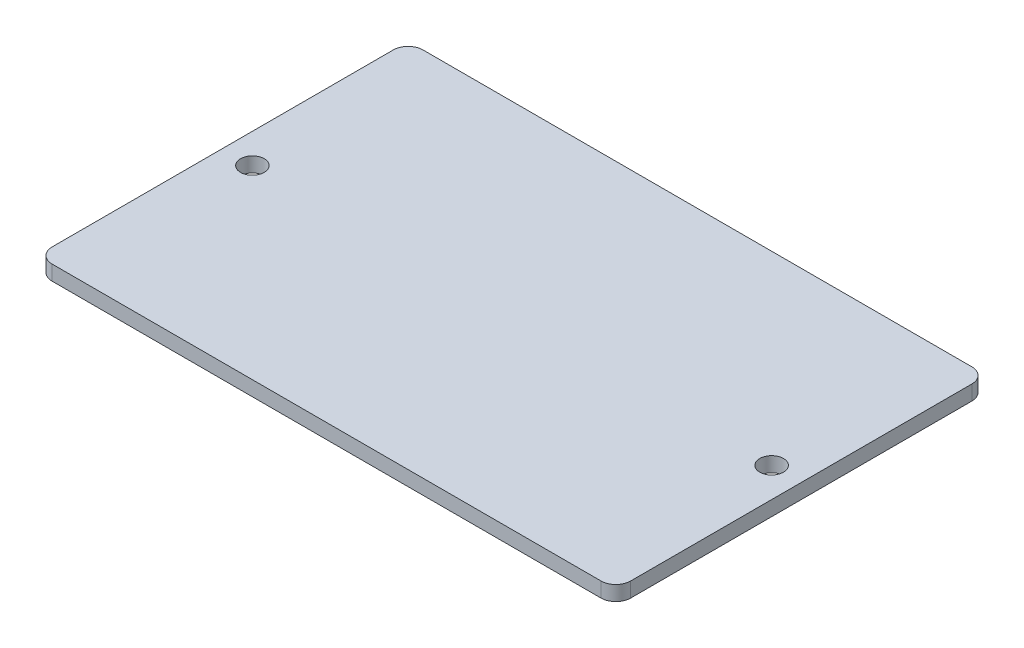
ISO-10303-21;
HEADER;
FILE_DESCRIPTION(('STEP AP214'),'2;1');
FILE_NAME('part.step','',(''),(''),'','','');
FILE_SCHEMA(('AUTOMOTIVE_DESIGN { 1 0 10303 214 1 1 1 1 }'));
ENDSEC;
DATA;
#1=APPLICATION_CONTEXT('core data for automotive mechanical design processes');
#2=APPLICATION_PROTOCOL_DEFINITION('international standard','automotive_design',2000,#1);
#3=PRODUCT_CONTEXT('',#1,'mechanical');
#4=PRODUCT('Part','Part','',(#3));
#5=PRODUCT_RELATED_PRODUCT_CATEGORY('part','',(#4));
#6=PRODUCT_DEFINITION_FORMATION('','',#4);
#7=PRODUCT_DEFINITION_CONTEXT('part definition',#1,'design');
#8=PRODUCT_DEFINITION('design','',#6,#7);
#9=PRODUCT_DEFINITION_SHAPE('','',#8);
#10=(LENGTH_UNIT() NAMED_UNIT(*) SI_UNIT(.MILLI.,.METRE.));
#11=(NAMED_UNIT(*) PLANE_ANGLE_UNIT() SI_UNIT($,.RADIAN.));
#12=(NAMED_UNIT(*) SI_UNIT($,.STERADIAN.) SOLID_ANGLE_UNIT());
#13=UNCERTAINTY_MEASURE_WITH_UNIT(LENGTH_MEASURE(1.E-05),#10,'distance_accuracy_value','');
#14=(GEOMETRIC_REPRESENTATION_CONTEXT(3) GLOBAL_UNCERTAINTY_ASSIGNED_CONTEXT((#13)) GLOBAL_UNIT_ASSIGNED_CONTEXT((#10,
#11,#12)) REPRESENTATION_CONTEXT('',''));
#15=CARTESIAN_POINT('',(0.,0.,0.));
#16=DIRECTION('',(0.,0.,1.));
#17=DIRECTION('',(1.,0.,0.));
#18=AXIS2_PLACEMENT_3D('',#15,#16,#17);
#19=CARTESIAN_POINT('',(-37.,2.,23.));
#20=DIRECTION('',(0.,1.,0.));
#21=DIRECTION('',(0.,0.,1.));
#22=AXIS2_PLACEMENT_3D('',#19,#20,#21);
#23=PLANE('',#22);
#24=CARTESIAN_POINT('',(-35.,2.,0.));
#25=DIRECTION('',(0.,1.,0.));
#26=DIRECTION('',(0.,0.,1.));
#27=AXIS2_PLACEMENT_3D('',#24,#25,#26);
#28=CIRCLE('',#27,1.6);
#29=CARTESIAN_POINT('',(-35.,2.,1.6));
#30=VERTEX_POINT('',#29);
#31=EDGE_CURVE('E138',#30,#30,#28,.T.);
#32=ORIENTED_EDGE('',*,*,#31,.F.);
#33=EDGE_LOOP('',(#32));
#34=FACE_BOUND('',#33,.T.);
#35=CARTESIAN_POINT('',(-37.,2.,23.));
#36=DIRECTION('',(0.,1.,0.));
#37=DIRECTION('',(0.,0.,1.));
#38=AXIS2_PLACEMENT_3D('',#35,#36,#37);
#39=CIRCLE('',#38,2.);
#40=CARTESIAN_POINT('',(-39.,2.,23.));
#41=VERTEX_POINT('',#40);
#42=CARTESIAN_POINT('',(-37.,2.,25.));
#43=VERTEX_POINT('',#42);
#44=EDGE_CURVE('E149',#41,#43,#39,.T.);
#45=ORIENTED_EDGE('',*,*,#44,.T.);
#46=DIRECTION('',(1.,0.,0.));
#47=VECTOR('',#46,1.);
#48=CARTESIAN_POINT('',(-37.,2.,25.));
#49=LINE('',#48,#47);
#50=CARTESIAN_POINT('',(37.,2.,25.));
#51=VERTEX_POINT('',#50);
#52=EDGE_CURVE('E97',#43,#51,#49,.T.);
#53=ORIENTED_EDGE('',*,*,#52,.T.);
#54=CARTESIAN_POINT('',(37.,2.,23.));
#55=DIRECTION('',(0.,1.,0.));
#56=DIRECTION('',(0.,0.,1.));
#57=AXIS2_PLACEMENT_3D('',#54,#55,#56);
#58=CIRCLE('',#57,2.);
#59=CARTESIAN_POINT('',(39.,2.,23.));
#60=VERTEX_POINT('',#59);
#61=EDGE_CURVE('E164',#51,#60,#58,.T.);
#62=ORIENTED_EDGE('',*,*,#61,.T.);
#63=DIRECTION('',(0.,0.,-1.));
#64=VECTOR('',#63,1.);
#65=CARTESIAN_POINT('',(39.,2.,23.));
#66=LINE('',#65,#64);
#67=CARTESIAN_POINT('',(39.,2.,-23.));
#68=VERTEX_POINT('',#67);
#69=EDGE_CURVE('E177',#60,#68,#66,.T.);
#70=ORIENTED_EDGE('',*,*,#69,.T.);
#71=CARTESIAN_POINT('',(37.,2.,-23.));
#72=DIRECTION('',(0.,1.,0.));
#73=DIRECTION('',(0.,0.,1.));
#74=AXIS2_PLACEMENT_3D('',#71,#72,#73);
#75=CIRCLE('',#74,2.);
#76=CARTESIAN_POINT('',(37.,2.,-25.));
#77=VERTEX_POINT('',#76);
#78=EDGE_CURVE('E116',#68,#77,#75,.T.);
#79=ORIENTED_EDGE('',*,*,#78,.T.);
#80=DIRECTION('',(-1.,0.,0.));
#81=VECTOR('',#80,1.);
#82=CARTESIAN_POINT('',(-37.,2.,-25.));
#83=LINE('',#82,#81);
#84=CARTESIAN_POINT('',(-37.,2.,-25.));
#85=VERTEX_POINT('',#84);
#86=EDGE_CURVE('E110',#77,#85,#83,.T.);
#87=ORIENTED_EDGE('',*,*,#86,.T.);
#88=CARTESIAN_POINT('',(-37.,2.,-23.));
#89=DIRECTION('',(0.,1.,0.));
#90=DIRECTION('',(0.,0.,-1.));
#91=AXIS2_PLACEMENT_3D('',#88,#89,#90);
#92=CIRCLE('',#91,2.);
#93=CARTESIAN_POINT('',(-39.,2.,-23.));
#94=VERTEX_POINT('',#93);
#95=EDGE_CURVE('E114',#85,#94,#92,.T.);
#96=ORIENTED_EDGE('',*,*,#95,.T.);
#97=DIRECTION('',(0.,0.,1.));
#98=VECTOR('',#97,1.);
#99=CARTESIAN_POINT('',(-39.,2.,23.));
#100=LINE('',#99,#98);
#101=EDGE_CURVE('E54',#94,#41,#100,.T.);
#102=ORIENTED_EDGE('',*,*,#101,.T.);
#103=EDGE_LOOP('',(#45,#53,#62,#70,#79,#87,#96,#102));
#104=FACE_BOUND('',#103,.T.);
#105=CARTESIAN_POINT('',(35.,2.,0.));
#106=DIRECTION('',(0.,1.,0.));
#107=DIRECTION('',(0.,0.,-1.));
#108=AXIS2_PLACEMENT_3D('',#105,#106,#107);
#109=CIRCLE('',#108,1.6);
#110=CARTESIAN_POINT('',(35.,2.,-1.6));
#111=VERTEX_POINT('',#110);
#112=EDGE_CURVE('E186',#111,#111,#109,.T.);
#113=ORIENTED_EDGE('',*,*,#112,.F.);
#114=EDGE_LOOP('',(#113));
#115=FACE_BOUND('',#114,.T.);
#116=ADVANCED_FACE('F37',(#34,#104,#115),#23,.T.);
#117=CARTESIAN_POINT('',(-37.,0.,23.));
#118=DIRECTION('',(0.,1.,0.));
#119=DIRECTION('',(0.,0.,1.));
#120=AXIS2_PLACEMENT_3D('',#117,#118,#119);
#121=PLANE('',#120);
#122=CARTESIAN_POINT('',(-37.,0.,23.));
#123=DIRECTION('',(0.,1.,0.));
#124=DIRECTION('',(0.,0.,1.));
#125=AXIS2_PLACEMENT_3D('',#122,#123,#124);
#126=CIRCLE('',#125,2.);
#127=CARTESIAN_POINT('',(-39.,0.,23.));
#128=VERTEX_POINT('',#127);
#129=CARTESIAN_POINT('',(-37.,0.,25.));
#130=VERTEX_POINT('',#129);
#131=EDGE_CURVE('E134',#128,#130,#126,.T.);
#132=ORIENTED_EDGE('',*,*,#131,.F.);
#133=DIRECTION('',(0.,0.,1.));
#134=VECTOR('',#133,1.);
#135=CARTESIAN_POINT('',(-39.,0.,23.));
#136=LINE('',#135,#134);
#137=CARTESIAN_POINT('',(-39.,0.,-23.));
#138=VERTEX_POINT('',#137);
#139=EDGE_CURVE('E89',#138,#128,#136,.T.);
#140=ORIENTED_EDGE('',*,*,#139,.F.);
#141=CARTESIAN_POINT('',(-37.,0.,-23.));
#142=DIRECTION('',(0.,1.,0.));
#143=DIRECTION('',(0.,0.,-1.));
#144=AXIS2_PLACEMENT_3D('',#141,#142,#143);
#145=CIRCLE('',#144,2.);
#146=CARTESIAN_POINT('',(-37.,0.,-25.));
#147=VERTEX_POINT('',#146);
#148=EDGE_CURVE('E83',#147,#138,#145,.T.);
#149=ORIENTED_EDGE('',*,*,#148,.F.);
#150=DIRECTION('',(-1.,0.,0.));
#151=VECTOR('',#150,1.);
#152=CARTESIAN_POINT('',(-37.,0.,-25.));
#153=LINE('',#152,#151);
#154=CARTESIAN_POINT('',(37.,0.,-25.));
#155=VERTEX_POINT('',#154);
#156=EDGE_CURVE('E124',#155,#147,#153,.T.);
#157=ORIENTED_EDGE('',*,*,#156,.F.);
#158=CARTESIAN_POINT('',(37.,0.,-23.));
#159=DIRECTION('',(0.,1.,0.));
#160=DIRECTION('',(0.,0.,1.));
#161=AXIS2_PLACEMENT_3D('',#158,#159,#160);
#162=CIRCLE('',#161,2.);
#163=CARTESIAN_POINT('',(39.,0.,-23.));
#164=VERTEX_POINT('',#163);
#165=EDGE_CURVE('E144',#164,#155,#162,.T.);
#166=ORIENTED_EDGE('',*,*,#165,.F.);
#167=DIRECTION('',(0.,0.,-1.));
#168=VECTOR('',#167,1.);
#169=CARTESIAN_POINT('',(39.,0.,23.));
#170=LINE('',#169,#168);
#171=CARTESIAN_POINT('',(39.,0.,23.));
#172=VERTEX_POINT('',#171);
#173=EDGE_CURVE('E142',#172,#164,#170,.T.);
#174=ORIENTED_EDGE('',*,*,#173,.F.);
#175=CARTESIAN_POINT('',(37.,0.,23.));
#176=DIRECTION('',(0.,1.,0.));
#177=DIRECTION('',(0.,0.,1.));
#178=AXIS2_PLACEMENT_3D('',#175,#176,#177);
#179=CIRCLE('',#178,2.);
#180=CARTESIAN_POINT('',(37.,0.,25.));
#181=VERTEX_POINT('',#180);
#182=EDGE_CURVE('E140',#181,#172,#179,.T.);
#183=ORIENTED_EDGE('',*,*,#182,.F.);
#184=DIRECTION('',(1.,0.,0.));
#185=VECTOR('',#184,1.);
#186=CARTESIAN_POINT('',(-37.,0.,25.));
#187=LINE('',#186,#185);
#188=EDGE_CURVE('E137',#130,#181,#187,.T.);
#189=ORIENTED_EDGE('',*,*,#188,.F.);
#190=EDGE_LOOP('',(#132,#140,#149,#157,#166,#174,#183,#189));
#191=FACE_BOUND('',#190,.T.);
#192=CARTESIAN_POINT('',(-35.,0.,0.));
#193=DIRECTION('',(0.,1.,0.));
#194=DIRECTION('',(0.,0.,1.));
#195=AXIS2_PLACEMENT_3D('',#192,#193,#194);
#196=CIRCLE('',#195,1.6);
#197=CARTESIAN_POINT('',(-35.,0.,1.6));
#198=VERTEX_POINT('',#197);
#199=EDGE_CURVE('E183',#198,#198,#196,.T.);
#200=ORIENTED_EDGE('',*,*,#199,.T.);
#201=EDGE_LOOP('',(#200));
#202=FACE_BOUND('',#201,.T.);
#203=CARTESIAN_POINT('',(35.,0.,0.));
#204=DIRECTION('',(0.,1.,0.));
#205=DIRECTION('',(0.,0.,-1.));
#206=AXIS2_PLACEMENT_3D('',#203,#204,#205);
#207=CIRCLE('',#206,1.6);
#208=CARTESIAN_POINT('',(35.,0.,-1.6));
#209=VERTEX_POINT('',#208);
#210=EDGE_CURVE('E189',#209,#209,#207,.T.);
#211=ORIENTED_EDGE('',*,*,#210,.T.);
#212=EDGE_LOOP('',(#211));
#213=FACE_BOUND('',#212,.T.);
#214=ADVANCED_FACE('F168',(#191,#202,#213),#121,.F.);
#215=CARTESIAN_POINT('',(-37.,2.,23.));
#216=DIRECTION('',(0.,-1.,0.));
#217=DIRECTION('',(0.,0.,-1.));
#218=AXIS2_PLACEMENT_3D('',#215,#216,#217);
#219=CYLINDRICAL_SURFACE('',#218,2.);
#220=ORIENTED_EDGE('',*,*,#131,.T.);
#221=DIRECTION('',(0.,-1.,0.));
#222=VECTOR('',#221,1.);
#223=CARTESIAN_POINT('',(-37.,2.,25.));
#224=LINE('',#223,#222);
#225=EDGE_CURVE('E11',#43,#130,#224,.T.);
#226=ORIENTED_EDGE('',*,*,#225,.F.);
#227=ORIENTED_EDGE('',*,*,#44,.F.);
#228=DIRECTION('',(0.,-1.,0.));
#229=VECTOR('',#228,1.);
#230=CARTESIAN_POINT('',(-39.,2.,23.));
#231=LINE('',#230,#229);
#232=EDGE_CURVE('E130',#41,#128,#231,.T.);
#233=ORIENTED_EDGE('',*,*,#232,.T.);
#234=EDGE_LOOP('',(#220,#226,#227,#233));
#235=FACE_BOUND('',#234,.T.);
#236=ADVANCED_FACE('F39',(#235),#219,.T.);
#237=CARTESIAN_POINT('',(-37.,2.,25.));
#238=DIRECTION('',(0.,0.,-1.));
#239=DIRECTION('',(-1.,0.,0.));
#240=AXIS2_PLACEMENT_3D('',#237,#238,#239);
#241=PLANE('',#240);
#242=ORIENTED_EDGE('',*,*,#188,.T.);
#243=DIRECTION('',(0.,-1.,0.));
#244=VECTOR('',#243,1.);
#245=CARTESIAN_POINT('',(37.,2.,25.));
#246=LINE('',#245,#244);
#247=EDGE_CURVE('E46',#51,#181,#246,.T.);
#248=ORIENTED_EDGE('',*,*,#247,.F.);
#249=ORIENTED_EDGE('',*,*,#52,.F.);
#250=ORIENTED_EDGE('',*,*,#225,.T.);
#251=EDGE_LOOP('',(#242,#248,#249,#250));
#252=FACE_BOUND('',#251,.T.);
#253=ADVANCED_FACE('F221',(#252),#241,.F.);
#254=CARTESIAN_POINT('',(37.,2.,23.));
#255=DIRECTION('',(0.,-1.,0.));
#256=DIRECTION('',(0.,0.,-1.));
#257=AXIS2_PLACEMENT_3D('',#254,#255,#256);
#258=CYLINDRICAL_SURFACE('',#257,2.);
#259=ORIENTED_EDGE('',*,*,#182,.T.);
#260=DIRECTION('',(0.,-1.,0.));
#261=VECTOR('',#260,1.);
#262=CARTESIAN_POINT('',(39.,2.,23.));
#263=LINE('',#262,#261);
#264=EDGE_CURVE('E156',#60,#172,#263,.T.);
#265=ORIENTED_EDGE('',*,*,#264,.F.);
#266=ORIENTED_EDGE('',*,*,#61,.F.);
#267=ORIENTED_EDGE('',*,*,#247,.T.);
#268=EDGE_LOOP('',(#259,#265,#266,#267));
#269=FACE_BOUND('',#268,.T.);
#270=ADVANCED_FACE('F162',(#269),#258,.T.);
#271=CARTESIAN_POINT('',(39.,2.,23.));
#272=DIRECTION('',(-1.,0.,0.));
#273=DIRECTION('',(0.,0.,1.));
#274=AXIS2_PLACEMENT_3D('',#271,#272,#273);
#275=PLANE('',#274);
#276=ORIENTED_EDGE('',*,*,#173,.T.);
#277=DIRECTION('',(0.,-1.,0.));
#278=VECTOR('',#277,1.);
#279=CARTESIAN_POINT('',(39.,2.,-23.));
#280=LINE('',#279,#278);
#281=EDGE_CURVE('E153',#68,#164,#280,.T.);
#282=ORIENTED_EDGE('',*,*,#281,.F.);
#283=ORIENTED_EDGE('',*,*,#69,.F.);
#284=ORIENTED_EDGE('',*,*,#264,.T.);
#285=EDGE_LOOP('',(#276,#282,#283,#284));
#286=FACE_BOUND('',#285,.T.);
#287=ADVANCED_FACE('F173',(#286),#275,.F.);
#288=CARTESIAN_POINT('',(37.,2.,-23.));
#289=DIRECTION('',(0.,-1.,0.));
#290=DIRECTION('',(0.,0.,-1.));
#291=AXIS2_PLACEMENT_3D('',#288,#289,#290);
#292=CYLINDRICAL_SURFACE('',#291,2.);
#293=ORIENTED_EDGE('',*,*,#165,.T.);
#294=DIRECTION('',(0.,-1.,0.));
#295=VECTOR('',#294,1.);
#296=CARTESIAN_POINT('',(37.,2.,-25.));
#297=LINE('',#296,#295);
#298=EDGE_CURVE('E125',#77,#155,#297,.T.);
#299=ORIENTED_EDGE('',*,*,#298,.F.);
#300=ORIENTED_EDGE('',*,*,#78,.F.);
#301=ORIENTED_EDGE('',*,*,#281,.T.);
#302=EDGE_LOOP('',(#293,#299,#300,#301));
#303=FACE_BOUND('',#302,.T.);
#304=ADVANCED_FACE('F176',(#303),#292,.T.);
#305=CARTESIAN_POINT('',(-37.,2.,-25.));
#306=DIRECTION('',(0.,0.,1.));
#307=DIRECTION('',(1.,0.,0.));
#308=AXIS2_PLACEMENT_3D('',#305,#306,#307);
#309=PLANE('',#308);
#310=ORIENTED_EDGE('',*,*,#156,.T.);
#311=DIRECTION('',(0.,-1.,0.));
#312=VECTOR('',#311,1.);
#313=CARTESIAN_POINT('',(-37.,2.,-25.));
#314=LINE('',#313,#312);
#315=EDGE_CURVE('E121',#85,#147,#314,.T.);
#316=ORIENTED_EDGE('',*,*,#315,.F.);
#317=ORIENTED_EDGE('',*,*,#86,.F.);
#318=ORIENTED_EDGE('',*,*,#298,.T.);
#319=EDGE_LOOP('',(#310,#316,#317,#318));
#320=FACE_BOUND('',#319,.T.);
#321=ADVANCED_FACE('F122',(#320),#309,.F.);
#322=CARTESIAN_POINT('',(-37.,2.,-23.));
#323=DIRECTION('',(0.,-1.,0.));
#324=DIRECTION('',(0.,0.,-1.));
#325=AXIS2_PLACEMENT_3D('',#322,#323,#324);
#326=CYLINDRICAL_SURFACE('',#325,2.);
#327=ORIENTED_EDGE('',*,*,#148,.T.);
#328=DIRECTION('',(0.,-1.,0.));
#329=VECTOR('',#328,1.);
#330=CARTESIAN_POINT('',(-39.,2.,-23.));
#331=LINE('',#330,#329);
#332=EDGE_CURVE('E126',#94,#138,#331,.T.);
#333=ORIENTED_EDGE('',*,*,#332,.F.);
#334=ORIENTED_EDGE('',*,*,#95,.F.);
#335=ORIENTED_EDGE('',*,*,#315,.T.);
#336=EDGE_LOOP('',(#327,#333,#334,#335));
#337=FACE_BOUND('',#336,.T.);
#338=ADVANCED_FACE('F128',(#337),#326,.T.);
#339=CARTESIAN_POINT('',(-39.,2.,23.));
#340=DIRECTION('',(1.,0.,0.));
#341=DIRECTION('',(0.,0.,-1.));
#342=AXIS2_PLACEMENT_3D('',#339,#340,#341);
#343=PLANE('',#342);
#344=ORIENTED_EDGE('',*,*,#139,.T.);
#345=ORIENTED_EDGE('',*,*,#232,.F.);
#346=ORIENTED_EDGE('',*,*,#101,.F.);
#347=ORIENTED_EDGE('',*,*,#332,.T.);
#348=EDGE_LOOP('',(#344,#345,#346,#347));
#349=FACE_BOUND('',#348,.T.);
#350=ADVANCED_FACE('F209',(#349),#343,.F.);
#351=CARTESIAN_POINT('',(-35.,2.,0.));
#352=DIRECTION('',(0.,-1.,0.));
#353=DIRECTION('',(0.,0.,-1.));
#354=AXIS2_PLACEMENT_3D('',#351,#352,#353);
#355=CYLINDRICAL_SURFACE('',#354,1.6);
#356=ORIENTED_EDGE('',*,*,#31,.T.);
#357=EDGE_LOOP('',(#356));
#358=FACE_BOUND('',#357,.T.);
#359=ORIENTED_EDGE('',*,*,#199,.F.);
#360=EDGE_LOOP('',(#359));
#361=FACE_BOUND('',#360,.T.);
#362=ADVANCED_FACE('F206',(#358,#361),#355,.F.);
#363=CARTESIAN_POINT('',(35.,2.,0.));
#364=DIRECTION('',(0.,-1.,0.));
#365=DIRECTION('',(0.,0.,-1.));
#366=AXIS2_PLACEMENT_3D('',#363,#364,#365);
#367=CYLINDRICAL_SURFACE('',#366,1.6);
#368=ORIENTED_EDGE('',*,*,#112,.T.);
#369=EDGE_LOOP('',(#368));
#370=FACE_BOUND('',#369,.T.);
#371=ORIENTED_EDGE('',*,*,#210,.F.);
#372=EDGE_LOOP('',(#371));
#373=FACE_BOUND('',#372,.T.);
#374=ADVANCED_FACE('F195',(#370,#373),#367,.F.);
#375=CLOSED_SHELL('',(#116,#214,#236,#253,#270,#287,#304,#321,#338,#350,#362,#374));
#376=MANIFOLD_SOLID_BREP('B2',#375);
#377=ADVANCED_BREP_SHAPE_REPRESENTATION('',(#18,#376),#14);
#378=SHAPE_DEFINITION_REPRESENTATION(#9,#377);
ENDSEC;
END-ISO-10303-21;
